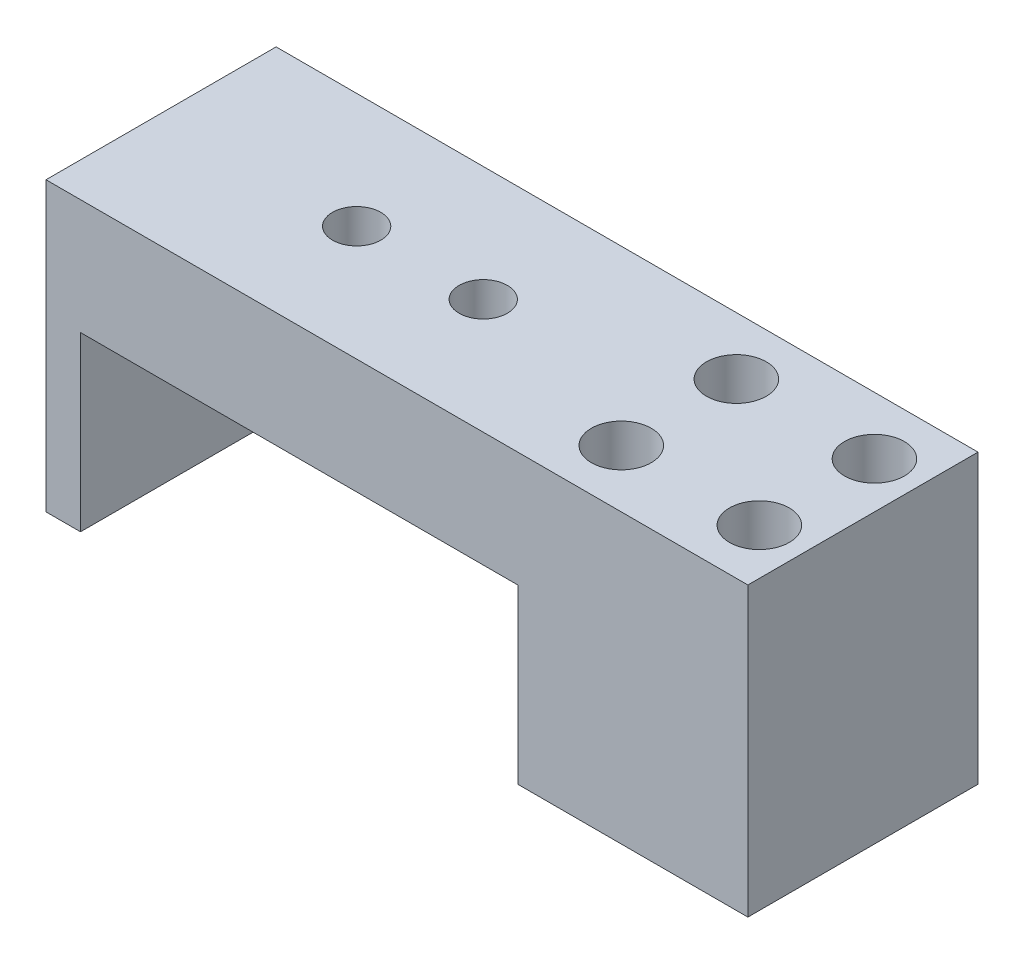
ISO-10303-21;
HEADER;
FILE_DESCRIPTION(('STEP AP214'),'2;1');
FILE_NAME('part.step','',(''),(''),'','','');
FILE_SCHEMA(('AUTOMOTIVE_DESIGN { 1 0 10303 214 1 1 1 1 }'));
ENDSEC;
DATA;
#1=APPLICATION_CONTEXT('core data for automotive mechanical design processes');
#2=APPLICATION_PROTOCOL_DEFINITION('international standard','automotive_design',2000,#1);
#3=PRODUCT_CONTEXT('',#1,'mechanical');
#4=PRODUCT('Part','Part','',(#3));
#5=PRODUCT_RELATED_PRODUCT_CATEGORY('part','',(#4));
#6=PRODUCT_DEFINITION_FORMATION('','',#4);
#7=PRODUCT_DEFINITION_CONTEXT('part definition',#1,'design');
#8=PRODUCT_DEFINITION('design','',#6,#7);
#9=PRODUCT_DEFINITION_SHAPE('','',#8);
#10=(LENGTH_UNIT() NAMED_UNIT(*) SI_UNIT(.MILLI.,.METRE.));
#11=(NAMED_UNIT(*) PLANE_ANGLE_UNIT() SI_UNIT($,.RADIAN.));
#12=(NAMED_UNIT(*) SI_UNIT($,.STERADIAN.) SOLID_ANGLE_UNIT());
#13=UNCERTAINTY_MEASURE_WITH_UNIT(LENGTH_MEASURE(1.E-05),#10,'distance_accuracy_value','');
#14=(GEOMETRIC_REPRESENTATION_CONTEXT(3) GLOBAL_UNCERTAINTY_ASSIGNED_CONTEXT((#13)) GLOBAL_UNIT_ASSIGNED_CONTEXT((#10,
#11,#12)) REPRESENTATION_CONTEXT('',''));
#15=CARTESIAN_POINT('',(0.,0.,0.));
#16=DIRECTION('',(0.,0.,1.));
#17=DIRECTION('',(1.,0.,0.));
#18=AXIS2_PLACEMENT_3D('',#15,#16,#17);
#19=CARTESIAN_POINT('',(0.,15.,0.));
#20=DIRECTION('',(0.,1.,0.));
#21=DIRECTION('',(0.,0.,1.));
#22=AXIS2_PLACEMENT_3D('',#19,#20,#21);
#23=PLANE('',#22);
#24=CARTESIAN_POINT('',(-23.,15.,0.));
#25=DIRECTION('',(0.,1.,0.));
#26=DIRECTION('',(0.,0.,1.));
#27=AXIS2_PLACEMENT_3D('',#24,#25,#26);
#28=CIRCLE('',#27,2.1);
#29=CARTESIAN_POINT('',(-23.,15.,2.1));
#30=VERTEX_POINT('',#29);
#31=EDGE_CURVE('E145',#30,#30,#28,.T.);
#32=ORIENTED_EDGE('',*,*,#31,.T.);
#33=EDGE_LOOP('',(#32));
#34=FACE_BOUND('',#33,.T.);
#35=CARTESIAN_POINT('',(-34.,15.,0.));
#36=DIRECTION('',(0.,1.,0.));
#37=DIRECTION('',(0.,0.,1.));
#38=AXIS2_PLACEMENT_3D('',#35,#36,#37);
#39=CIRCLE('',#38,2.1);
#40=CARTESIAN_POINT('',(-34.,15.,2.1));
#41=VERTEX_POINT('',#40);
#42=EDGE_CURVE('E421',#41,#41,#39,.T.);
#43=ORIENTED_EDGE('',*,*,#42,.T.);
#44=EDGE_LOOP('',(#43));
#45=FACE_BOUND('',#44,.T.);
#46=DIRECTION('',(0.,0.,1.));
#47=VECTOR('',#46,1.);
#48=CARTESIAN_POINT('',(-48.,15.,10.));
#49=LINE('',#48,#47);
#50=CARTESIAN_POINT('',(-48.,15.,-10.));
#51=VERTEX_POINT('',#50);
#52=CARTESIAN_POINT('',(-48.,15.,10.));
#53=VERTEX_POINT('',#52);
#54=EDGE_CURVE('E67',#51,#53,#49,.T.);
#55=ORIENTED_EDGE('',*,*,#54,.F.);
#56=DIRECTION('',(-1.,0.,0.));
#57=VECTOR('',#56,1.);
#58=CARTESIAN_POINT('',(0.,15.,-10.));
#59=LINE('',#58,#57);
#60=CARTESIAN_POINT('',(-10.,15.,-10.));
#61=VERTEX_POINT('',#60);
#62=EDGE_CURVE('E160',#61,#51,#59,.T.);
#63=ORIENTED_EDGE('',*,*,#62,.F.);
#64=DIRECTION('',(0.,0.,1.));
#65=VECTOR('',#64,1.);
#66=CARTESIAN_POINT('',(-10.,15.,0.));
#67=LINE('',#66,#65);
#68=CARTESIAN_POINT('',(-10.,15.,10.));
#69=VERTEX_POINT('',#68);
#70=EDGE_CURVE('E125',#61,#69,#67,.T.);
#71=ORIENTED_EDGE('',*,*,#70,.T.);
#72=DIRECTION('',(-1.,0.,0.));
#73=VECTOR('',#72,1.);
#74=CARTESIAN_POINT('',(0.,15.,10.));
#75=LINE('',#74,#73);
#76=EDGE_CURVE('E63',#69,#53,#75,.T.);
#77=ORIENTED_EDGE('',*,*,#76,.T.);
#78=EDGE_LOOP('',(#55,#63,#71,#77));
#79=FACE_BOUND('',#78,.T.);
#80=ADVANCED_FACE('F47',(#34,#45,#79),#23,.F.);
#81=CARTESIAN_POINT('',(-10.,25.,10.));
#82=DIRECTION('',(1.,0.,0.));
#83=DIRECTION('',(0.,0.,-1.));
#84=AXIS2_PLACEMENT_3D('',#81,#82,#83);
#85=PLANE('',#84);
#86=ORIENTED_EDGE('',*,*,#70,.F.);
#87=DIRECTION('',(0.,-1.,0.));
#88=VECTOR('',#87,1.);
#89=CARTESIAN_POINT('',(-10.,25.,-10.));
#90=LINE('',#89,#88);
#91=CARTESIAN_POINT('',(-10.,0.,-10.));
#92=VERTEX_POINT('',#91);
#93=EDGE_CURVE('E56',#61,#92,#90,.T.);
#94=ORIENTED_EDGE('',*,*,#93,.T.);
#95=DIRECTION('',(0.,0.,1.));
#96=VECTOR('',#95,1.);
#97=CARTESIAN_POINT('',(-10.,0.,10.));
#98=LINE('',#97,#96);
#99=CARTESIAN_POINT('',(-10.,0.,10.));
#100=VERTEX_POINT('',#99);
#101=EDGE_CURVE('E222',#92,#100,#98,.T.);
#102=ORIENTED_EDGE('',*,*,#101,.T.);
#103=DIRECTION('',(0.,-1.,0.));
#104=VECTOR('',#103,1.);
#105=CARTESIAN_POINT('',(-10.,25.,10.));
#106=LINE('',#105,#104);
#107=EDGE_CURVE('E231',#69,#100,#106,.T.);
#108=ORIENTED_EDGE('',*,*,#107,.F.);
#109=EDGE_LOOP('',(#86,#94,#102,#108));
#110=FACE_BOUND('',#109,.T.);
#111=ADVANCED_FACE('F236',(#110),#85,.F.);
#112=CARTESIAN_POINT('',(0.,25.,0.));
#113=DIRECTION('',(0.,-1.,0.));
#114=DIRECTION('',(0.,0.,-1.));
#115=AXIS2_PLACEMENT_3D('',#112,#113,#114);
#116=PLANE('',#115);
#117=CARTESIAN_POINT('',(-23.,25.,0.));
#118=DIRECTION('',(0.,1.,0.));
#119=DIRECTION('',(0.,0.,1.));
#120=AXIS2_PLACEMENT_3D('',#117,#118,#119);
#121=CIRCLE('',#120,2.1);
#122=CARTESIAN_POINT('',(-23.,25.,2.1));
#123=VERTEX_POINT('',#122);
#124=EDGE_CURVE('E418',#123,#123,#121,.T.);
#125=ORIENTED_EDGE('',*,*,#124,.F.);
#126=EDGE_LOOP('',(#125));
#127=FACE_BOUND('',#126,.T.);
#128=CARTESIAN_POINT('',(-34.,25.,0.));
#129=DIRECTION('',(0.,1.,0.));
#130=DIRECTION('',(0.,0.,1.));
#131=AXIS2_PLACEMENT_3D('',#128,#129,#130);
#132=CIRCLE('',#131,2.1);
#133=CARTESIAN_POINT('',(-34.,25.,2.1));
#134=VERTEX_POINT('',#133);
#135=EDGE_CURVE('E426',#134,#134,#132,.T.);
#136=ORIENTED_EDGE('',*,*,#135,.F.);
#137=EDGE_LOOP('',(#136));
#138=FACE_BOUND('',#137,.T.);
#139=DIRECTION('',(0.,0.,-1.));
#140=VECTOR('',#139,1.);
#141=CARTESIAN_POINT('',(10.,25.,10.));
#142=LINE('',#141,#140);
#143=CARTESIAN_POINT('',(10.,25.,10.));
#144=VERTEX_POINT('',#143);
#145=CARTESIAN_POINT('',(10.,25.,-10.));
#146=VERTEX_POINT('',#145);
#147=EDGE_CURVE('E204',#144,#146,#142,.T.);
#148=ORIENTED_EDGE('',*,*,#147,.T.);
#149=DIRECTION('',(-1.,0.,0.));
#150=VECTOR('',#149,1.);
#151=CARTESIAN_POINT('',(-10.,25.,-10.));
#152=LINE('',#151,#150);
#153=CARTESIAN_POINT('',(-51.,25.,-10.));
#154=VERTEX_POINT('',#153);
#155=EDGE_CURVE('E208',#146,#154,#152,.T.);
#156=ORIENTED_EDGE('',*,*,#155,.T.);
#157=DIRECTION('',(0.,0.,1.));
#158=VECTOR('',#157,1.);
#159=CARTESIAN_POINT('',(-51.,25.,0.));
#160=LINE('',#159,#158);
#161=CARTESIAN_POINT('',(-51.,25.,10.));
#162=VERTEX_POINT('',#161);
#163=EDGE_CURVE('E121',#154,#162,#160,.T.);
#164=ORIENTED_EDGE('',*,*,#163,.T.);
#165=DIRECTION('',(1.,0.,0.));
#166=VECTOR('',#165,1.);
#167=CARTESIAN_POINT('',(-10.,25.,10.));
#168=LINE('',#167,#166);
#169=EDGE_CURVE('E212',#162,#144,#168,.T.);
#170=ORIENTED_EDGE('',*,*,#169,.T.);
#171=EDGE_LOOP('',(#148,#156,#164,#170));
#172=FACE_BOUND('',#171,.T.);
#173=CARTESIAN_POINT('',(-6.,25.,-5.));
#174=DIRECTION('',(0.,1.,0.));
#175=DIRECTION('',(0.,0.,1.));
#176=AXIS2_PLACEMENT_3D('',#173,#174,#175);
#177=CIRCLE('',#176,2.6);
#178=CARTESIAN_POINT('',(-6.,25.,-2.4));
#179=VERTEX_POINT('',#178);
#180=EDGE_CURVE('E196',#179,#179,#177,.T.);
#181=ORIENTED_EDGE('',*,*,#180,.F.);
#182=EDGE_LOOP('',(#181));
#183=FACE_BOUND('',#182,.T.);
#184=CARTESIAN_POINT('',(6.,25.,-5.));
#185=DIRECTION('',(0.,1.,0.));
#186=DIRECTION('',(0.,0.,1.));
#187=AXIS2_PLACEMENT_3D('',#184,#185,#186);
#188=CIRCLE('',#187,2.6);
#189=CARTESIAN_POINT('',(6.,25.,-2.4));
#190=VERTEX_POINT('',#189);
#191=EDGE_CURVE('E188',#190,#190,#188,.T.);
#192=ORIENTED_EDGE('',*,*,#191,.F.);
#193=EDGE_LOOP('',(#192));
#194=FACE_BOUND('',#193,.T.);
#195=CARTESIAN_POINT('',(-6.,25.,5.));
#196=DIRECTION('',(0.,1.,0.));
#197=DIRECTION('',(0.,0.,1.));
#198=AXIS2_PLACEMENT_3D('',#195,#196,#197);
#199=CIRCLE('',#198,2.6);
#200=CARTESIAN_POINT('',(-6.,25.,7.6));
#201=VERTEX_POINT('',#200);
#202=EDGE_CURVE('E180',#201,#201,#199,.T.);
#203=ORIENTED_EDGE('',*,*,#202,.F.);
#204=EDGE_LOOP('',(#203));
#205=FACE_BOUND('',#204,.T.);
#206=CARTESIAN_POINT('',(6.,25.,5.));
#207=DIRECTION('',(0.,1.,0.));
#208=DIRECTION('',(0.,0.,1.));
#209=AXIS2_PLACEMENT_3D('',#206,#207,#208);
#210=CIRCLE('',#209,2.6);
#211=CARTESIAN_POINT('',(6.,25.,7.6));
#212=VERTEX_POINT('',#211);
#213=EDGE_CURVE('E172',#212,#212,#210,.T.);
#214=ORIENTED_EDGE('',*,*,#213,.F.);
#215=EDGE_LOOP('',(#214));
#216=FACE_BOUND('',#215,.T.);
#217=ADVANCED_FACE('F250',(#127,#138,#172,#183,#194,#205,#216),#116,.F.);
#218=CARTESIAN_POINT('',(0.,0.,0.));
#219=DIRECTION('',(0.,-1.,0.));
#220=DIRECTION('',(0.,0.,-1.));
#221=AXIS2_PLACEMENT_3D('',#218,#219,#220);
#222=PLANE('',#221);
#223=CARTESIAN_POINT('',(-6.,0.,5.));
#224=DIRECTION('',(0.,1.,0.));
#225=DIRECTION('',(0.,0.,1.));
#226=AXIS2_PLACEMENT_3D('',#223,#224,#225);
#227=CIRCLE('',#226,2.6);
#228=CARTESIAN_POINT('',(-6.,0.,7.6));
#229=VERTEX_POINT('',#228);
#230=EDGE_CURVE('E176',#229,#229,#227,.T.);
#231=ORIENTED_EDGE('',*,*,#230,.T.);
#232=EDGE_LOOP('',(#231));
#233=FACE_BOUND('',#232,.T.);
#234=CARTESIAN_POINT('',(-6.,0.,-5.));
#235=DIRECTION('',(0.,1.,0.));
#236=DIRECTION('',(0.,0.,1.));
#237=AXIS2_PLACEMENT_3D('',#234,#235,#236);
#238=CIRCLE('',#237,2.6);
#239=CARTESIAN_POINT('',(-6.,0.,-2.4));
#240=VERTEX_POINT('',#239);
#241=EDGE_CURVE('E192',#240,#240,#238,.T.);
#242=ORIENTED_EDGE('',*,*,#241,.T.);
#243=EDGE_LOOP('',(#242));
#244=FACE_BOUND('',#243,.T.);
#245=DIRECTION('',(0.,0.,-1.));
#246=VECTOR('',#245,1.);
#247=CARTESIAN_POINT('',(10.,0.,10.));
#248=LINE('',#247,#246);
#249=CARTESIAN_POINT('',(10.,0.,10.));
#250=VERTEX_POINT('',#249);
#251=CARTESIAN_POINT('',(10.,0.,-10.));
#252=VERTEX_POINT('',#251);
#253=EDGE_CURVE('E200',#250,#252,#248,.T.);
#254=ORIENTED_EDGE('',*,*,#253,.F.);
#255=DIRECTION('',(1.,0.,0.));
#256=VECTOR('',#255,1.);
#257=CARTESIAN_POINT('',(-10.,0.,10.));
#258=LINE('',#257,#256);
#259=EDGE_CURVE('E209',#100,#250,#258,.T.);
#260=ORIENTED_EDGE('',*,*,#259,.F.);
#261=ORIENTED_EDGE('',*,*,#101,.F.);
#262=DIRECTION('',(-1.,0.,0.));
#263=VECTOR('',#262,1.);
#264=CARTESIAN_POINT('',(-10.,0.,-10.));
#265=LINE('',#264,#263);
#266=EDGE_CURVE('E219',#252,#92,#265,.T.);
#267=ORIENTED_EDGE('',*,*,#266,.F.);
#268=EDGE_LOOP('',(#254,#260,#261,#267));
#269=FACE_BOUND('',#268,.T.);
#270=CARTESIAN_POINT('',(6.,0.,-5.));
#271=DIRECTION('',(0.,1.,0.));
#272=DIRECTION('',(0.,0.,1.));
#273=AXIS2_PLACEMENT_3D('',#270,#271,#272);
#274=CIRCLE('',#273,2.6);
#275=CARTESIAN_POINT('',(6.,0.,-2.4));
#276=VERTEX_POINT('',#275);
#277=EDGE_CURVE('E184',#276,#276,#274,.T.);
#278=ORIENTED_EDGE('',*,*,#277,.T.);
#279=EDGE_LOOP('',(#278));
#280=FACE_BOUND('',#279,.T.);
#281=CARTESIAN_POINT('',(6.,0.,5.));
#282=DIRECTION('',(0.,1.,0.));
#283=DIRECTION('',(0.,0.,1.));
#284=AXIS2_PLACEMENT_3D('',#281,#282,#283);
#285=CIRCLE('',#284,2.6);
#286=CARTESIAN_POINT('',(6.,0.,7.6));
#287=VERTEX_POINT('',#286);
#288=EDGE_CURVE('E170',#287,#287,#285,.T.);
#289=ORIENTED_EDGE('',*,*,#288,.T.);
#290=EDGE_LOOP('',(#289));
#291=FACE_BOUND('',#290,.T.);
#292=ADVANCED_FACE('F242',(#233,#244,#269,#280,#291),#222,.T.);
#293=CARTESIAN_POINT('',(10.,25.,10.));
#294=DIRECTION('',(-1.,0.,0.));
#295=DIRECTION('',(0.,0.,1.));
#296=AXIS2_PLACEMENT_3D('',#293,#294,#295);
#297=PLANE('',#296);
#298=ORIENTED_EDGE('',*,*,#253,.T.);
#299=DIRECTION('',(0.,-1.,0.));
#300=VECTOR('',#299,1.);
#301=CARTESIAN_POINT('',(10.,25.,-10.));
#302=LINE('',#301,#300);
#303=EDGE_CURVE('E11',#146,#252,#302,.T.);
#304=ORIENTED_EDGE('',*,*,#303,.F.);
#305=ORIENTED_EDGE('',*,*,#147,.F.);
#306=DIRECTION('',(0.,-1.,0.));
#307=VECTOR('',#306,1.);
#308=CARTESIAN_POINT('',(10.,25.,10.));
#309=LINE('',#308,#307);
#310=EDGE_CURVE('E215',#144,#250,#309,.T.);
#311=ORIENTED_EDGE('',*,*,#310,.T.);
#312=EDGE_LOOP('',(#298,#304,#305,#311));
#313=FACE_BOUND('',#312,.T.);
#314=ADVANCED_FACE('F49',(#313),#297,.F.);
#315=CARTESIAN_POINT('',(-10.,25.,-10.));
#316=DIRECTION('',(0.,0.,1.));
#317=DIRECTION('',(1.,0.,0.));
#318=AXIS2_PLACEMENT_3D('',#315,#316,#317);
#319=PLANE('',#318);
#320=ORIENTED_EDGE('',*,*,#266,.T.);
#321=ORIENTED_EDGE('',*,*,#93,.F.);
#322=ORIENTED_EDGE('',*,*,#62,.T.);
#323=DIRECTION('',(0.,1.,0.));
#324=VECTOR('',#323,1.);
#325=CARTESIAN_POINT('',(-48.,0.,-10.));
#326=LINE('',#325,#324);
#327=CARTESIAN_POINT('',(-48.,0.,-10.));
#328=VERTEX_POINT('',#327);
#329=EDGE_CURVE('E132',#328,#51,#326,.T.);
#330=ORIENTED_EDGE('',*,*,#329,.F.);
#331=DIRECTION('',(1.,0.,0.));
#332=VECTOR('',#331,1.);
#333=CARTESIAN_POINT('',(-51.,0.,-10.));
#334=LINE('',#333,#332);
#335=CARTESIAN_POINT('',(-51.,0.,-10.));
#336=VERTEX_POINT('',#335);
#337=EDGE_CURVE('E128',#336,#328,#334,.T.);
#338=ORIENTED_EDGE('',*,*,#337,.F.);
#339=DIRECTION('',(0.,1.,0.));
#340=VECTOR('',#339,1.);
#341=CARTESIAN_POINT('',(-51.,15.,-10.));
#342=LINE('',#341,#340);
#343=EDGE_CURVE('E114',#336,#154,#342,.T.);
#344=ORIENTED_EDGE('',*,*,#343,.T.);
#345=ORIENTED_EDGE('',*,*,#155,.F.);
#346=ORIENTED_EDGE('',*,*,#303,.T.);
#347=EDGE_LOOP('',(#320,#321,#322,#330,#338,#344,#345,#346));
#348=FACE_BOUND('',#347,.T.);
#349=ADVANCED_FACE('F130',(#348),#319,.F.);
#350=CARTESIAN_POINT('',(-10.,25.,10.));
#351=DIRECTION('',(0.,0.,-1.));
#352=DIRECTION('',(-1.,0.,0.));
#353=AXIS2_PLACEMENT_3D('',#350,#351,#352);
#354=PLANE('',#353);
#355=ORIENTED_EDGE('',*,*,#259,.T.);
#356=ORIENTED_EDGE('',*,*,#310,.F.);
#357=ORIENTED_EDGE('',*,*,#169,.F.);
#358=DIRECTION('',(0.,1.,0.));
#359=VECTOR('',#358,1.);
#360=CARTESIAN_POINT('',(-51.,15.,10.));
#361=LINE('',#360,#359);
#362=CARTESIAN_POINT('',(-51.,0.,10.));
#363=VERTEX_POINT('',#362);
#364=EDGE_CURVE('E124',#363,#162,#361,.T.);
#365=ORIENTED_EDGE('',*,*,#364,.F.);
#366=DIRECTION('',(-1.,0.,0.));
#367=VECTOR('',#366,1.);
#368=CARTESIAN_POINT('',(-51.,0.,10.));
#369=LINE('',#368,#367);
#370=CARTESIAN_POINT('',(-48.,0.,10.));
#371=VERTEX_POINT('',#370);
#372=EDGE_CURVE('E141',#371,#363,#369,.T.);
#373=ORIENTED_EDGE('',*,*,#372,.F.);
#374=DIRECTION('',(0.,1.,0.));
#375=VECTOR('',#374,1.);
#376=CARTESIAN_POINT('',(-48.,0.,10.));
#377=LINE('',#376,#375);
#378=EDGE_CURVE('E153',#371,#53,#377,.T.);
#379=ORIENTED_EDGE('',*,*,#378,.T.);
#380=ORIENTED_EDGE('',*,*,#76,.F.);
#381=ORIENTED_EDGE('',*,*,#107,.T.);
#382=EDGE_LOOP('',(#355,#356,#357,#365,#373,#379,#380,#381));
#383=FACE_BOUND('',#382,.T.);
#384=ADVANCED_FACE('F246',(#383),#354,.F.);
#385=CARTESIAN_POINT('',(-6.,25.,-5.));
#386=DIRECTION('',(0.,-1.,0.));
#387=DIRECTION('',(0.,0.,-1.));
#388=AXIS2_PLACEMENT_3D('',#385,#386,#387);
#389=CYLINDRICAL_SURFACE('',#388,2.6);
#390=ORIENTED_EDGE('',*,*,#180,.T.);
#391=EDGE_LOOP('',(#390));
#392=FACE_BOUND('',#391,.T.);
#393=ORIENTED_EDGE('',*,*,#241,.F.);
#394=EDGE_LOOP('',(#393));
#395=FACE_BOUND('',#394,.T.);
#396=ADVANCED_FACE('F286',(#392,#395),#389,.F.);
#397=CARTESIAN_POINT('',(6.,25.,-5.));
#398=DIRECTION('',(0.,-1.,0.));
#399=DIRECTION('',(0.,0.,-1.));
#400=AXIS2_PLACEMENT_3D('',#397,#398,#399);
#401=CYLINDRICAL_SURFACE('',#400,2.6);
#402=ORIENTED_EDGE('',*,*,#191,.T.);
#403=EDGE_LOOP('',(#402));
#404=FACE_BOUND('',#403,.T.);
#405=ORIENTED_EDGE('',*,*,#277,.F.);
#406=EDGE_LOOP('',(#405));
#407=FACE_BOUND('',#406,.T.);
#408=ADVANCED_FACE('F282',(#404,#407),#401,.F.);
#409=CARTESIAN_POINT('',(-6.,25.,5.));
#410=DIRECTION('',(0.,-1.,0.));
#411=DIRECTION('',(0.,0.,-1.));
#412=AXIS2_PLACEMENT_3D('',#409,#410,#411);
#413=CYLINDRICAL_SURFACE('',#412,2.6);
#414=ORIENTED_EDGE('',*,*,#202,.T.);
#415=EDGE_LOOP('',(#414));
#416=FACE_BOUND('',#415,.T.);
#417=ORIENTED_EDGE('',*,*,#230,.F.);
#418=EDGE_LOOP('',(#417));
#419=FACE_BOUND('',#418,.T.);
#420=ADVANCED_FACE('F278',(#416,#419),#413,.F.);
#421=CARTESIAN_POINT('',(6.,25.,5.));
#422=DIRECTION('',(0.,-1.,0.));
#423=DIRECTION('',(0.,0.,-1.));
#424=AXIS2_PLACEMENT_3D('',#421,#422,#423);
#425=CYLINDRICAL_SURFACE('',#424,2.6);
#426=ORIENTED_EDGE('',*,*,#213,.T.);
#427=EDGE_LOOP('',(#426));
#428=FACE_BOUND('',#427,.T.);
#429=ORIENTED_EDGE('',*,*,#288,.F.);
#430=EDGE_LOOP('',(#429));
#431=FACE_BOUND('',#430,.T.);
#432=ADVANCED_FACE('F263',(#428,#431),#425,.F.);
#433=CARTESIAN_POINT('',(-51.,15.,0.));
#434=DIRECTION('',(-1.,0.,0.));
#435=DIRECTION('',(0.,0.,1.));
#436=AXIS2_PLACEMENT_3D('',#433,#434,#435);
#437=PLANE('',#436);
#438=ORIENTED_EDGE('',*,*,#163,.F.);
#439=ORIENTED_EDGE('',*,*,#343,.F.);
#440=DIRECTION('',(0.,0.,-1.));
#441=VECTOR('',#440,1.);
#442=CARTESIAN_POINT('',(-51.,0.,10.));
#443=LINE('',#442,#441);
#444=EDGE_CURVE('E119',#363,#336,#443,.T.);
#445=ORIENTED_EDGE('',*,*,#444,.F.);
#446=ORIENTED_EDGE('',*,*,#364,.T.);
#447=EDGE_LOOP('',(#438,#439,#445,#446));
#448=FACE_BOUND('',#447,.T.);
#449=ADVANCED_FACE('F116',(#448),#437,.T.);
#450=CARTESIAN_POINT('',(-48.,0.,10.));
#451=DIRECTION('',(-1.,0.,0.));
#452=DIRECTION('',(0.,0.,1.));
#453=AXIS2_PLACEMENT_3D('',#450,#451,#452);
#454=PLANE('',#453);
#455=ORIENTED_EDGE('',*,*,#54,.T.);
#456=ORIENTED_EDGE('',*,*,#378,.F.);
#457=DIRECTION('',(0.,0.,1.));
#458=VECTOR('',#457,1.);
#459=CARTESIAN_POINT('',(-48.,0.,10.));
#460=LINE('',#459,#458);
#461=EDGE_CURVE('E136',#328,#371,#460,.T.);
#462=ORIENTED_EDGE('',*,*,#461,.F.);
#463=ORIENTED_EDGE('',*,*,#329,.T.);
#464=EDGE_LOOP('',(#455,#456,#462,#463));
#465=FACE_BOUND('',#464,.T.);
#466=ADVANCED_FACE('F254',(#465),#454,.F.);
#467=CARTESIAN_POINT('',(0.,0.,0.));
#468=DIRECTION('',(0.,-1.,0.));
#469=DIRECTION('',(0.,0.,-1.));
#470=AXIS2_PLACEMENT_3D('',#467,#468,#469);
#471=PLANE('',#470);
#472=ORIENTED_EDGE('',*,*,#444,.T.);
#473=ORIENTED_EDGE('',*,*,#337,.T.);
#474=ORIENTED_EDGE('',*,*,#461,.T.);
#475=ORIENTED_EDGE('',*,*,#372,.T.);
#476=EDGE_LOOP('',(#472,#473,#474,#475));
#477=FACE_BOUND('',#476,.T.);
#478=ADVANCED_FACE('F139',(#477),#471,.T.);
#479=CARTESIAN_POINT('',(-34.,0.,0.));
#480=DIRECTION('',(0.,1.,0.));
#481=DIRECTION('',(0.,0.,1.));
#482=AXIS2_PLACEMENT_3D('',#479,#480,#481);
#483=CYLINDRICAL_SURFACE('',#482,2.1);
#484=ORIENTED_EDGE('',*,*,#135,.T.);
#485=EDGE_LOOP('',(#484));
#486=FACE_BOUND('',#485,.T.);
#487=ORIENTED_EDGE('',*,*,#42,.F.);
#488=EDGE_LOOP('',(#487));
#489=FACE_BOUND('',#488,.T.);
#490=ADVANCED_FACE('F261',(#486,#489),#483,.F.);
#491=CARTESIAN_POINT('',(-23.,0.,0.));
#492=DIRECTION('',(0.,1.,0.));
#493=DIRECTION('',(0.,0.,1.));
#494=AXIS2_PLACEMENT_3D('',#491,#492,#493);
#495=CYLINDRICAL_SURFACE('',#494,2.1);
#496=ORIENTED_EDGE('',*,*,#124,.T.);
#497=EDGE_LOOP('',(#496));
#498=FACE_BOUND('',#497,.T.);
#499=ORIENTED_EDGE('',*,*,#31,.F.);
#500=EDGE_LOOP('',(#499));
#501=FACE_BOUND('',#500,.T.);
#502=ADVANCED_FACE('F363',(#498,#501),#495,.F.);
#503=CLOSED_SHELL('',(#80,#111,#217,#292,#314,#349,#384,#396,#408,#420,#432,#449,#466,#478,#490,#502));
#504=MANIFOLD_SOLID_BREP('B2',#503);
#505=ADVANCED_BREP_SHAPE_REPRESENTATION('',(#18,#504),#14);
#506=SHAPE_DEFINITION_REPRESENTATION(#9,#505);
ENDSEC;
END-ISO-10303-21;
